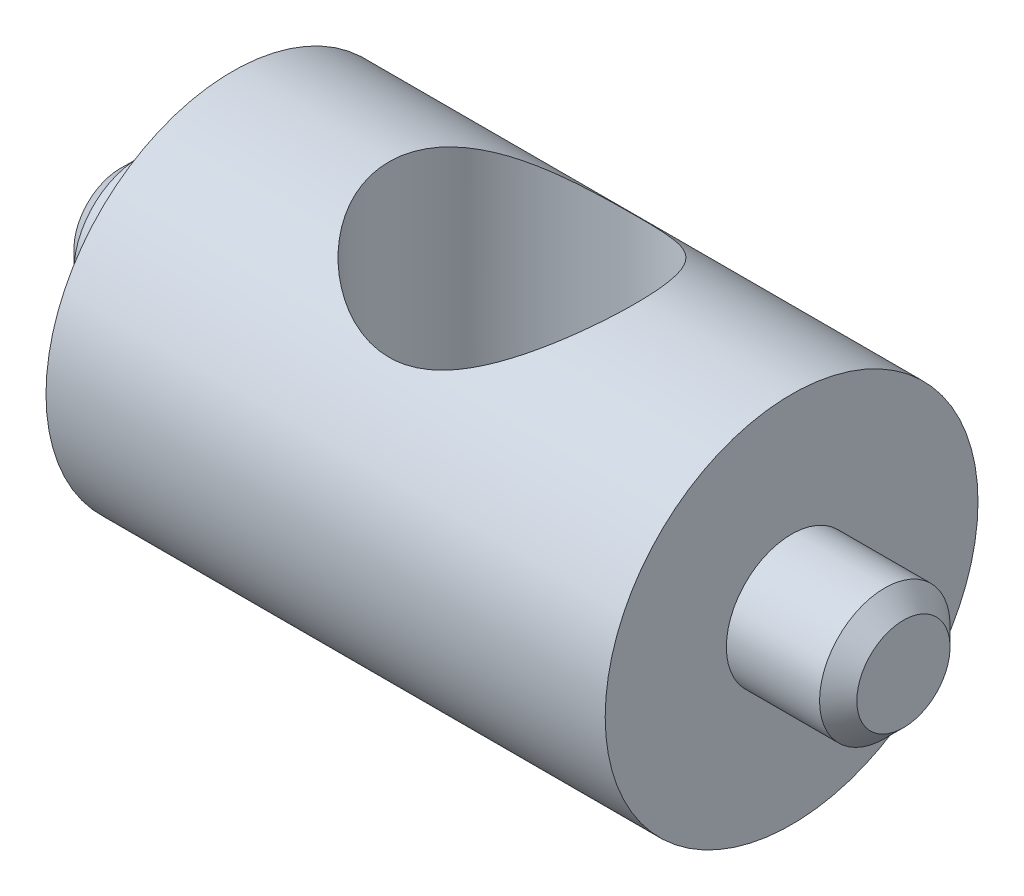
ISO-10303-21;
HEADER;
FILE_DESCRIPTION(('STEP AP214'),'2;1');
FILE_NAME('part.step','',(''),(''),'','','');
FILE_SCHEMA(('AUTOMOTIVE_DESIGN { 1 0 10303 214 1 1 1 1 }'));
ENDSEC;
DATA;
#1=APPLICATION_CONTEXT('core data for automotive mechanical design processes');
#2=APPLICATION_PROTOCOL_DEFINITION('international standard','automotive_design',2000,#1);
#3=PRODUCT_CONTEXT('',#1,'mechanical');
#4=PRODUCT('Part','Part','',(#3));
#5=PRODUCT_RELATED_PRODUCT_CATEGORY('part','',(#4));
#6=PRODUCT_DEFINITION_FORMATION('','',#4);
#7=PRODUCT_DEFINITION_CONTEXT('part definition',#1,'design');
#8=PRODUCT_DEFINITION('design','',#6,#7);
#9=PRODUCT_DEFINITION_SHAPE('','',#8);
#10=(LENGTH_UNIT() NAMED_UNIT(*) SI_UNIT(.MILLI.,.METRE.));
#11=(NAMED_UNIT(*) PLANE_ANGLE_UNIT() SI_UNIT($,.RADIAN.));
#12=(NAMED_UNIT(*) SI_UNIT($,.STERADIAN.) SOLID_ANGLE_UNIT());
#13=UNCERTAINTY_MEASURE_WITH_UNIT(LENGTH_MEASURE(1.E-05),#10,'distance_accuracy_value','');
#14=(GEOMETRIC_REPRESENTATION_CONTEXT(3) GLOBAL_UNCERTAINTY_ASSIGNED_CONTEXT((#13)) GLOBAL_UNIT_ASSIGNED_CONTEXT((#10,
#11,#12)) REPRESENTATION_CONTEXT('',''));
#15=CARTESIAN_POINT('',(0.,0.,0.));
#16=DIRECTION('',(0.,0.,1.));
#17=DIRECTION('',(1.,0.,0.));
#18=AXIS2_PLACEMENT_3D('',#15,#16,#17);
#19=CARTESIAN_POINT('',(-21.,0.,0.));
#20=DIRECTION('',(1.,0.,0.));
#21=DIRECTION('',(0.,0.,-1.));
#22=AXIS2_PLACEMENT_3D('',#19,#20,#21);
#23=PLANE('',#22);
#24=CARTESIAN_POINT('',(-21.,0.,0.));
#25=DIRECTION('',(1.,0.,0.));
#26=DIRECTION('',(0.,0.,-1.));
#27=AXIS2_PLACEMENT_3D('',#24,#25,#26);
#28=CIRCLE('',#27,1.25000000000001);
#29=CARTESIAN_POINT('',(-21.,0.,-1.25000000000001));
#30=VERTEX_POINT('',#29);
#31=EDGE_CURVE('E64',#30,#30,#28,.F.);
#32=ORIENTED_EDGE('',*,*,#31,.T.);
#33=EDGE_LOOP('',(#32));
#34=FACE_BOUND('',#33,.T.);
#35=ADVANCED_FACE('F40',(#34),#23,.F.);
#36=CARTESIAN_POINT('',(-35.932586733368,0.,0.));
#37=DIRECTION('',(-1.,0.,0.));
#38=DIRECTION('',(0.,0.,1.));
#39=AXIS2_PLACEMENT_3D('',#36,#37,#38);
#40=CYLINDRICAL_SURFACE('',#39,1.75);
#41=CARTESIAN_POINT('',(-20.5,0.,0.));
#42=DIRECTION('',(1.,0.,0.));
#43=DIRECTION('',(0.,0.,-1.));
#44=AXIS2_PLACEMENT_3D('',#41,#42,#43);
#45=CIRCLE('',#44,1.75);
#46=CARTESIAN_POINT('',(-20.5,0.,-1.75));
#47=VERTEX_POINT('',#46);
#48=EDGE_CURVE('E59',#47,#47,#45,.T.);
#49=ORIENTED_EDGE('',*,*,#48,.T.);
#50=EDGE_LOOP('',(#49));
#51=FACE_BOUND('',#50,.T.);
#52=CARTESIAN_POINT('',(-18.,0.,0.));
#53=DIRECTION('',(-1.,0.,0.));
#54=DIRECTION('',(0.,0.,1.));
#55=AXIS2_PLACEMENT_3D('',#52,#53,#54);
#56=CIRCLE('',#55,1.75);
#57=CARTESIAN_POINT('',(-18.,0.,1.75));
#58=VERTEX_POINT('',#57);
#59=EDGE_CURVE('E124',#58,#58,#56,.T.);
#60=ORIENTED_EDGE('',*,*,#59,.T.);
#61=EDGE_LOOP('',(#60));
#62=FACE_BOUND('',#61,.T.);
#63=ADVANCED_FACE('F98',(#51,#62),#40,.T.);
#64=CARTESIAN_POINT('',(-18.,1.75,0.));
#65=DIRECTION('',(1.,0.,0.));
#66=DIRECTION('',(0.,0.,-1.));
#67=AXIS2_PLACEMENT_3D('',#64,#65,#66);
#68=PLANE('',#67);
#69=ORIENTED_EDGE('',*,*,#59,.F.);
#70=EDGE_LOOP('',(#69));
#71=FACE_BOUND('',#70,.T.);
#72=CARTESIAN_POINT('',(-18.,0.,0.));
#73=DIRECTION('',(-1.,0.,0.));
#74=DIRECTION('',(0.,0.,1.));
#75=AXIS2_PLACEMENT_3D('',#72,#73,#74);
#76=CIRCLE('',#75,5.);
#77=CARTESIAN_POINT('',(-18.,0.,5.));
#78=VERTEX_POINT('',#77);
#79=EDGE_CURVE('E130',#78,#78,#76,.T.);
#80=ORIENTED_EDGE('',*,*,#79,.T.);
#81=EDGE_LOOP('',(#80));
#82=FACE_BOUND('',#81,.T.);
#83=ADVANCED_FACE('F94',(#71,#82),#68,.F.);
#84=CARTESIAN_POINT('',(-35.932586733368,0.,0.));
#85=DIRECTION('',(-1.,0.,0.));
#86=DIRECTION('',(0.,0.,1.));
#87=AXIS2_PLACEMENT_3D('',#84,#85,#86);
#88=CYLINDRICAL_SURFACE('',#87,5.);
#89=CARTESIAN_POINT('',(-13.8,-5.,0.));
#90=CARTESIAN_POINT('',(-13.7999943611885,-4.99999502028465,0.166108710098672));
#91=CARTESIAN_POINT('',(-13.7873858250924,-4.99164753654693,0.332252498914091));
#92=CARTESIAN_POINT('',(-13.7377125989929,-4.95907653058056,0.65925676172374));
#93=CARTESIAN_POINT('',(-13.7006328501233,-4.93484323274975,0.820113918452736));
#94=CARTESIAN_POINT('',(-13.6042743408841,-4.87290139155569,1.13133315611172));
#95=CARTESIAN_POINT('',(-13.5450998117015,-4.83525615606229,1.28174064243974));
#96=CARTESIAN_POINT('',(-13.4070539211593,-4.74953043835422,1.56990203300708));
#97=CARTESIAN_POINT('',(-13.3281799884932,-4.70144859398629,1.70765428218146));
#98=CARTESIAN_POINT('',(-13.145739026376,-4.59391320882249,1.97967369690098));
#99=CARTESIAN_POINT('',(-13.0406531316869,-4.5338433717197,2.11267338712332));
#100=CARTESIAN_POINT('',(-12.8123790467943,-4.40997691658213,2.3603657120324));
#101=CARTESIAN_POINT('',(-12.6891652417367,-4.34617510337841,2.47503195500737));
#102=CARTESIAN_POINT('',(-12.4060507859958,-4.21013569170478,2.70086298078244));
#103=CARTESIAN_POINT('',(-12.2434226613522,-4.13811352517936,2.80876420400794));
#104=CARTESIAN_POINT('',(-11.8982416669063,-4.004985037006,2.99553986488907));
#105=CARTESIAN_POINT('',(-11.7157239773053,-3.94385993007193,3.07446450871726));
#106=CARTESIAN_POINT('',(-11.3882712104839,-3.85768009853687,3.18144981131808));
#107=CARTESIAN_POINT('',(-11.2473879383095,-3.82731140798266,3.21759047163841));
#108=CARTESIAN_POINT('',(-10.9598037022303,-3.78171686850453,3.27106798534483));
#109=CARTESIAN_POINT('',(-10.8131128910142,-3.76646570994091,3.28843627169807));
#110=CARTESIAN_POINT('',(-10.5173533483337,-3.75345502550718,3.30328522471618));
#111=CARTESIAN_POINT('',(-10.3682776930258,-3.75576227122264,3.30068997308214));
#112=CARTESIAN_POINT('',(-10.0730470765962,-3.77763788475175,3.2756222186249));
#113=CARTESIAN_POINT('',(-9.92689468913715,-3.79722083238981,3.25313292618685));
#114=CARTESIAN_POINT('',(-9.64726482245536,-3.8495429246868,3.19101249701415));
#115=CARTESIAN_POINT('',(-9.51351391935375,-3.88172023925271,3.15210848368895));
#116=CARTESIAN_POINT('',(-9.25430091748071,-3.95554016109238,3.05895820499945));
#117=CARTESIAN_POINT('',(-9.12884155630582,-3.99718587457051,3.00470690337154));
#118=CARTESIAN_POINT('',(-8.86290181356779,-4.09534689411061,2.86991118840526));
#119=CARTESIAN_POINT('',(-8.72447542024702,-4.15316821979757,2.78627309404565));
#120=CARTESIAN_POINT('',(-8.46201613583647,-4.2719636274419,2.6004841327672));
#121=CARTESIAN_POINT('',(-8.33800118650155,-4.33294150559811,2.49831058648533));
#122=CARTESIAN_POINT('',(-8.08159163521438,-4.4659051432063,2.25363350243056));
#123=CARTESIAN_POINT('',(-7.95277126312606,-4.53755838228618,2.10715945828944));
#124=CARTESIAN_POINT('',(-7.7213875182802,-4.67138209023644,1.79097028772677));
#125=CARTESIAN_POINT('',(-7.6187985376901,-4.73356178329532,1.62127807796112));
#126=CARTESIAN_POINT('',(-7.46153874028141,-4.83107163272198,1.29747885255322));
#127=CARTESIAN_POINT('',(-7.40140859238575,-4.86927827550549,1.14689281517846));
#128=CARTESIAN_POINT('',(-7.30348806291977,-4.9321668292038,0.835952102745351));
#129=CARTESIAN_POINT('',(-7.26567898723602,-4.95686005646507,0.675605726589939));
#130=CARTESIAN_POINT('',(-7.21429574910262,-4.99053806559512,0.348733519143495));
#131=CARTESIAN_POINT('',(-7.20082007734955,-4.99945900529635,0.182185347019977));
#132=CARTESIAN_POINT('',(-7.19925317006995,-5.0004926515669,-0.151090954294901));
#133=CARTESIAN_POINT('',(-7.21116109529651,-4.99260591384121,-0.317819077354457));
#134=CARTESIAN_POINT('',(-7.25799645951894,-4.96188552601813,-0.635181990133433));
#135=CARTESIAN_POINT('',(-7.29135750362683,-4.94006962951612,-0.786153811834619));
#136=CARTESIAN_POINT('',(-7.37793028689531,-4.884283635727,-1.07988019820454));
#137=CARTESIAN_POINT('',(-7.43114521435539,-4.85031158634097,-1.22263343881362));
#138=CARTESIAN_POINT('',(-7.55936397391898,-4.7701857792491,-1.50612380113317));
#139=CARTESIAN_POINT('',(-7.63554961985883,-4.72338877459165,-1.64613997808855));
#140=CARTESIAN_POINT('',(-7.80565784463877,-4.6222077528961,-1.91192488806832));
#141=CARTESIAN_POINT('',(-7.89959212595509,-4.56781873631822,-2.03768413282188));
#142=CARTESIAN_POINT('',(-8.1192216083794,-4.44617198705788,-2.29225677449161));
#143=CARTESIAN_POINT('',(-8.24758833834775,-4.37823534715727,-2.41844252214993));
#144=CARTESIAN_POINT('',(-8.52333114446552,-4.24296654132022,-2.64859586348366));
#145=CARTESIAN_POINT('',(-8.6707181645745,-4.1756347474461,-2.75255057357021));
#146=CARTESIAN_POINT('',(-8.96740679863461,-4.05491811042689,-2.92707280109245));
#147=CARTESIAN_POINT('',(-9.11505909545937,-4.0008121534813,-2.99993302294647));
#148=CARTESIAN_POINT('',(-9.42299263819253,-3.90495718130228,-3.12369425956629));
#149=CARTESIAN_POINT('',(-9.58325045328032,-3.86318589532471,-3.17463492797536));
#150=CARTESIAN_POINT('',(-9.8855971225215,-3.80386546293905,-3.24536399087742));
#151=CARTESIAN_POINT('',(-10.0262166605061,-3.78342635400983,-3.26894766111121));
#152=CARTESIAN_POINT('',(-10.3106776631035,-3.75843740759422,-3.29765655618299));
#153=CARTESIAN_POINT('',(-10.4545159048156,-3.75387233408162,-3.3027994807441));
#154=CARTESIAN_POINT('',(-10.7411822510331,-3.76133210537923,-3.29429853523358));
#155=CARTESIAN_POINT('',(-10.8840103202048,-3.77335752763225,-3.28065401125281));
#156=CARTESIAN_POINT('',(-11.1648049297324,-3.81215585003775,-3.23547879226547));
#157=CARTESIAN_POINT('',(-11.3027647982596,-3.83894821205136,-3.20392449170545));
#158=CARTESIAN_POINT('',(-11.6083413057152,-3.91289022491186,-3.11344763662037));
#159=CARTESIAN_POINT('',(-11.7735435063226,-3.96362822464801,-3.04935599134409));
#160=CARTESIAN_POINT('',(-12.0887896412793,-4.07583386672655,-2.89766420424647));
#161=CARTESIAN_POINT('',(-12.2388121136513,-4.13731637459582,-2.81003140070026));
#162=CARTESIAN_POINT('',(-12.5246840794622,-4.26529629098292,-2.61178611200579));
#163=CARTESIAN_POINT('',(-12.6602457103062,-4.331861722496,-2.50080460661305));
#164=CARTESIAN_POINT('',(-12.9127245619386,-4.46314010332462,-2.2581808806654));
#165=CARTESIAN_POINT('',(-13.0296364198491,-4.52785251541748,-2.1265327387837));
#166=CARTESIAN_POINT('',(-13.1958321809237,-4.62332464314167,-1.90588764586633));
#167=CARTESIAN_POINT('',(-13.2523684227856,-4.65658028787928,-1.82333941616893));
#168=CARTESIAN_POINT('',(-13.3581645487176,-4.71988387666673,-1.65256618994112));
#169=CARTESIAN_POINT('',(-13.4074279100888,-4.7499333517286,-1.5643439354252));
#170=CARTESIAN_POINT('',(-13.4980230915444,-4.80592095491253,-1.38279849314792));
#171=CARTESIAN_POINT('',(-13.5393643237897,-4.83186395541528,-1.28948152992106));
#172=CARTESIAN_POINT('',(-13.6135270500507,-4.8788554955818,-1.09838943293768));
#173=CARTESIAN_POINT('',(-13.6463520121404,-4.89990602723681,-1.00061613306229));
#174=CARTESIAN_POINT('',(-13.7157236375915,-4.94468119082629,-0.756133259341444));
#175=CARTESIAN_POINT('',(-13.7472005075712,-4.96528498623918,-0.607349631931563));
#176=CARTESIAN_POINT('',(-13.7893356928824,-4.99294304369993,-0.305719088871816));
#177=CARTESIAN_POINT('',(-13.8000051895529,-5.00000458296857,-0.152874400317295));
#178=CARTESIAN_POINT('',(-13.8,-5.,0.));
#179=B_SPLINE_CURVE_WITH_KNOTS('',3,(#89,#90,#91,#92,#93,#94,#95,#96,#97,#98,#99,#100,#101,#102,
#103,#104,#105,#106,#107,#108,#109,#110,#111,#112,#113,#114,#115,#116,#117,#118,#119,#120,#121,
#122,#123,#124,#125,#126,#127,#128,#129,#130,#131,#132,#133,#134,#135,#136,#137,#138,#139,#140,
#141,#142,#143,#144,#145,#146,#147,#148,#149,#150,#151,#152,#153,#154,#155,#156,#157,#158,#159,
#160,#161,#162,#163,#164,#165,#166,#167,#168,#169,#170,#171,#172,#173,#174,#175,#176,#177,#178),
.UNSPECIFIED.,.T.,.F.,(4,2,2,2,2,2,2,2,2,2,2,2,2,2,2,2,2,2,2,2,2,2,2,2,2,2,2,2,2,2,2,2,2,2,2,2,
2,2,2,2,2,2,2,2,4),(0.,0.497726346438328,0.995759265011475,1.49147182327557,1.98724911932336,
2.52472285398069,3.06296346909751,3.68416119442296,4.30427746662549,4.74824206332347,
5.19146211660388,5.63636849926013,6.0816507201402,6.50899317832885,6.93647603335879,
7.44993759598858,7.96403170330016,8.58448225944135,9.20432478137938,9.70198972827775,
10.1992372825104,10.6984929984065,11.1977322078819,11.6641183533543,12.1305794272009,
12.627059041866,13.1238671575372,13.6987737764681,14.2740126744385,14.7920218070748,
15.3090898529516,15.7393109775655,16.1691190583515,16.5989420992603,17.0293329781066,
17.5793444324805,18.130122966495,18.6903664780719,19.2507708024659,19.5666924494275,
19.8824625556849,20.1978551421486,20.5131190892222,20.9714366484685,21.4295078518911),.UNSPECIFIED.);
#180=CARTESIAN_POINT('',(-13.8,-5.,0.));
#181=VERTEX_POINT('',#180);
#182=EDGE_CURVE('E10',#181,#181,#179,.T.);
#183=ORIENTED_EDGE('',*,*,#182,.T.);
#184=EDGE_LOOP('',(#183));
#185=FACE_BOUND('',#184,.T.);
#186=CARTESIAN_POINT('',(-10.5,3.75632799419859,3.3));
#187=CARTESIAN_POINT('',(-10.5808328035541,3.75632034068253,3.30000469991596));
#188=CARTESIAN_POINT('',(-10.6616331441055,3.75894514819494,3.2970270028327));
#189=CARTESIAN_POINT('',(-10.8224991006649,3.76929395841671,3.28519268099924));
#190=CARTESIAN_POINT('',(-10.9025645671875,3.77701897626405,3.27633488588152));
#191=CARTESIAN_POINT('',(-11.0613388907219,3.79722090967184,3.25289861749666));
#192=CARTESIAN_POINT('',(-11.1400459117131,3.80970379908599,3.23831295177074));
#193=CARTESIAN_POINT('',(-11.2954699141301,3.83887160299462,3.20368164011157));
#194=CARTESIAN_POINT('',(-11.3721858638929,3.85555864972917,3.1836332231901));
#195=CARTESIAN_POINT('',(-11.5971624593058,3.9106000137406,3.11617633548866));
#196=CARTESIAN_POINT('',(-11.7419438565215,3.95417390734364,3.06119665841899));
#197=CARTESIAN_POINT('',(-12.0199195076028,4.05006804336513,2.93314323737888));
#198=CARTESIAN_POINT('',(-12.1531112170257,4.10239019908004,2.86006553357735));
#199=CARTESIAN_POINT('',(-12.4264211232277,4.21943336138612,2.68497487992134));
#200=CARTESIAN_POINT('',(-12.5645144768536,4.28483009958964,2.58025207827139));
#201=CARTESIAN_POINT('',(-12.8229743883406,4.41517326533073,2.35025919723939));
#202=CARTESIAN_POINT('',(-12.9433239849493,4.48011920617503,2.22496969679138));
#203=CARTESIAN_POINT('',(-13.1165812283686,4.57753337479149,2.01330163660346));
#204=CARTESIAN_POINT('',(-13.1762694313582,4.61198002131685,1.93329401134096));
#205=CARTESIAN_POINT('',(-13.288601649869,4.67805851138964,1.76740647266276));
#206=CARTESIAN_POINT('',(-13.341248884277,4.70969163894955,1.68152926993491));
#207=CARTESIAN_POINT('',(-13.4388963971442,4.76923654241945,1.50436472285813));
#208=CARTESIAN_POINT('',(-13.4839007660791,4.79715030720502,1.41308030797008));
#209=CARTESIAN_POINT('',(-13.565649261652,4.84842150261802,1.22565887290276));
#210=CARTESIAN_POINT('',(-13.6023951124925,4.87177988417736,1.12952287077345));
#211=CARTESIAN_POINT('',(-13.6634234716522,4.91088206157612,0.944036218297515));
#212=CARTESIAN_POINT('',(-13.6886339565399,4.92718174864422,0.855107813942848));
#213=CARTESIAN_POINT('',(-13.7316082007735,4.95510084996898,0.674758403177167));
#214=CARTESIAN_POINT('',(-13.7493733809472,4.96672115720055,0.583337875901359));
#215=CARTESIAN_POINT('',(-13.7771259423381,4.98492159339129,0.398907822203913));
#216=CARTESIAN_POINT('',(-13.7871207565257,4.99150653897338,0.305899901522933));
#217=CARTESIAN_POINT('',(-13.7991759406972,4.99945458509008,0.119183398594345));
#218=CARTESIAN_POINT('',(-13.801237394461,5.00081839888562,0.0254749138036905));
#219=CARTESIAN_POINT('',(-13.7959962832785,4.99735470156518,-0.227310173080534));
#220=CARTESIAN_POINT('',(-13.7811330465739,4.98752780710882,-0.38625014627874));
#221=CARTESIAN_POINT('',(-13.7290794671699,4.95344130946267,-0.698707472956844));
#222=CARTESIAN_POINT('',(-13.691887480834,4.92918064379297,-0.852224426363109));
#223=CARTESIAN_POINT('',(-13.5971690686483,4.8683819237218,-1.14971660266121));
#224=CARTESIAN_POINT('',(-13.5397000509535,4.83187854506441,-1.29371741494539));
#225=CARTESIAN_POINT('',(-13.406636195436,4.74929647463493,-1.57003628564077));
#226=CARTESIAN_POINT('',(-13.3310379355112,4.70321597529091,-1.70235213192125));
#227=CARTESIAN_POINT('',(-13.1528962540669,4.5980447774444,-1.97009329194165));
#228=CARTESIAN_POINT('',(-13.0481245679526,4.53804109537535,-2.10367372412714));
#229=CARTESIAN_POINT('',(-12.8203804903757,4.4141844114235,-2.35251956536639));
#230=CARTESIAN_POINT('',(-12.697380144608,4.35032558829371,-2.46775627052381));
#231=CARTESIAN_POINT('',(-12.4150137937046,4.21422095539497,-2.69449862293978));
#232=CARTESIAN_POINT('',(-12.2529613921193,4.14216856539377,-2.80279991205088));
#233=CARTESIAN_POINT('',(-11.908940448696,4.00875915605853,-2.99050460310514));
#234=CARTESIAN_POINT('',(-11.7270068429694,3.9473838513265,-3.06995766894008));
#235=CARTESIAN_POINT('',(-11.4000980231064,3.8604241242264,-3.17813219498004));
#236=CARTESIAN_POINT('',(-11.2591661237478,3.82962752773358,-3.21484131617385));
#237=CARTESIAN_POINT('',(-10.9713696766155,3.7831392498888,-3.26943056839627));
#238=CARTESIAN_POINT('',(-10.8245154921042,3.76742228236837,-3.28734222456948));
#239=CARTESIAN_POINT('',(-10.5282779620281,3.75351270993072,-3.30322201627699));
#240=CARTESIAN_POINT('',(-10.378886911605,3.75538964839794,-3.30111100788955));
#241=CARTESIAN_POINT('',(-10.0829334157415,3.77651829460744,-3.27691017579369));
#242=CARTESIAN_POINT('',(-9.93637340174476,3.79578431359181,-3.25480389591166));
#243=CARTESIAN_POINT('',(-9.65631213978163,3.84754641529864,-3.19341308351927));
#244=CARTESIAN_POINT('',(-9.52252031301888,3.87943658687403,-3.15490987890829));
#245=CARTESIAN_POINT('',(-9.26317642029136,3.95274950238599,-3.06255431939491));
#246=CARTESIAN_POINT('',(-9.137627103684,3.99417540649065,-3.00869687464051));
#247=CARTESIAN_POINT('',(-8.87169306743346,4.09184048090701,-2.8748874359208));
#248=CARTESIAN_POINT('',(-8.73333255480008,4.14938676540834,-2.79187482996907));
#249=CARTESIAN_POINT('',(-8.47090800665095,4.26772614257934,-2.60740385857645));
#250=CARTESIAN_POINT('',(-8.34686166838993,4.32852312123433,-2.50592305101424));
#251=CARTESIAN_POINT('',(-8.09004558637145,4.46132208666665,-2.26265118716519));
#252=CARTESIAN_POINT('',(-7.96085651143773,4.53301505734816,-2.11686736878664));
#253=CARTESIAN_POINT('',(-7.72858588963537,4.66709483079829,-1.80205827224493));
#254=CARTESIAN_POINT('',(-7.62547967569073,4.72949040317013,-1.63305518823095));
#255=CARTESIAN_POINT('',(-7.4669259239447,4.82767856958792,-1.31004487389785));
#256=CARTESIAN_POINT('',(-7.40610641232805,4.86628589212662,-1.15953396552451));
#257=CARTESIAN_POINT('',(-7.30681540008732,4.93000688406096,-0.848611435594714));
#258=CARTESIAN_POINT('',(-7.26832518634858,4.95513185104415,-0.688208229398042));
#259=CARTESIAN_POINT('',(-7.21561558374301,4.98966718389319,-0.361064115000356));
#260=CARTESIAN_POINT('',(-7.20149673391073,4.99901245042292,-0.19429984068167));
#261=CARTESIAN_POINT('',(-7.19873043457225,5.0008376198483,0.13954060936531));
#262=CARTESIAN_POINT('',(-7.21008182590642,4.99331829025766,0.306616770553763));
#263=CARTESIAN_POINT('',(-7.25591896331189,4.96324448975663,0.624497684179487));
#264=CARTESIAN_POINT('',(-7.28879653524275,4.94173582286798,0.775640811829075));
#265=CARTESIAN_POINT('',(-7.37445232775415,4.88650995006837,1.06978191300973));
#266=CARTESIAN_POINT('',(-7.42723367574502,4.85279082560424,1.21277860245311));
#267=CARTESIAN_POINT('',(-7.5545139315903,4.77318196944304,1.49659946274411));
#268=CARTESIAN_POINT('',(-7.63016789565923,4.72666124587104,1.63672410409441));
#269=CARTESIAN_POINT('',(-7.7992151789931,4.62597329910768,1.90279946751913));
#270=CARTESIAN_POINT('',(-7.89261996133958,4.5718011406277,2.02874094626101));
#271=CARTESIAN_POINT('',(-8.11105810396569,4.45056263813156,2.28372554674123));
#272=CARTESIAN_POINT('',(-8.23875421793992,4.38280613983599,2.41016067480579));
#273=CARTESIAN_POINT('',(-8.51313686655812,4.24774594796383,2.64093531178594));
#274=CARTESIAN_POINT('',(-8.65983564054414,4.18044257588748,2.74526046482088));
#275=CARTESIAN_POINT('',(-8.95594577331737,4.05926347444089,2.92107485155351));
#276=CARTESIAN_POINT('',(-9.10378766446403,4.00471979811661,2.99473675204751));
#277=CARTESIAN_POINT('',(-9.41222051199397,3.90794187024756,3.11998197813732));
#278=CARTESIAN_POINT('',(-9.57278338710108,3.86568141694667,3.17161241165936));
#279=CARTESIAN_POINT('',(-9.86137657297142,3.80831125262273,3.24009605137427));
#280=CARTESIAN_POINT('',(-9.98727334976011,3.78902736893447,3.2624582500962));
#281=CARTESIAN_POINT('',(-10.2421420580733,3.76304522883302,3.2924024993676));
#282=CARTESIAN_POINT('',(-10.3711122963676,3.75634019771086,3.29999250599572));
#283=CARTESIAN_POINT('',(-10.5,3.75632799419859,3.3));
#284=B_SPLINE_CURVE_WITH_KNOTS('',3,(#186,#187,#188,#189,#190,#191,#192,#193,#194,#195,#196,
#197,#198,#199,#200,#201,#202,#203,#204,#205,#206,#207,#208,#209,#210,#211,#212,#213,#214,#215,
#216,#217,#218,#219,#220,#221,#222,#223,#224,#225,#226,#227,#228,#229,#230,#231,#232,#233,#234,
#235,#236,#237,#238,#239,#240,#241,#242,#243,#244,#245,#246,#247,#248,#249,#250,#251,#252,#253,
#254,#255,#256,#257,#258,#259,#260,#261,#262,#263,#264,#265,#266,#267,#268,#269,#270,#271,#272,
#273,#274,#275,#276,#277,#278,#279,#280,#281,#282,#283),.UNSPECIFIED.,.T.,.F.,(4,2,2,2,2,2,2,2,
2,2,2,2,2,2,2,2,2,2,2,2,2,2,2,2,2,2,2,2,2,2,2,2,2,2,2,2,2,2,2,2,2,2,2,2,2,2,2,2,4),(0.,
0.242346562582374,0.484741375997029,0.727441541664081,0.97026504725607,1.45079360698386,
1.93142739893815,2.4851233692169,3.03934523269319,3.35576290953679,3.67203543307438,
3.98813814985147,4.30417480968889,4.58532916772532,4.86642984708851,5.14726129940125,
5.42805438584568,5.90530512510263,6.38259099946519,6.85853628812263,7.33457148771491,
7.87268829158052,8.41163902374084,9.03215933205793,9.65160625593664,10.096392802684,
10.5404322019819,10.9862274924227,11.4323900080049,11.8593257161564,12.2864031162016,
12.7985244909691,13.3112723901066,13.9310107618911,14.5501608251217,15.0486475340571,
15.5467158794154,16.0468340358446,16.5469294321824,17.0133720923553,17.4798880735816,
17.9756813075918,18.4717958085011,19.0456724832362,19.6199206389234,20.139844423051,
20.658650861001,21.0452801408669,21.4317011303791),.UNSPECIFIED.);
#285=CARTESIAN_POINT('',(-10.5,3.75632799419859,3.3));
#286=VERTEX_POINT('',#285);
#287=EDGE_CURVE('E54',#286,#286,#284,.T.);
#288=ORIENTED_EDGE('',*,*,#287,.T.);
#289=EDGE_LOOP('',(#288));
#290=FACE_BOUND('',#289,.T.);
#291=ORIENTED_EDGE('',*,*,#79,.F.);
#292=EDGE_LOOP('',(#291));
#293=FACE_BOUND('',#292,.T.);
#294=CARTESIAN_POINT('',(-3.,0.,0.));
#295=DIRECTION('',(-1.,0.,0.));
#296=DIRECTION('',(0.,0.,1.));
#297=AXIS2_PLACEMENT_3D('',#294,#295,#296);
#298=CIRCLE('',#297,5.);
#299=CARTESIAN_POINT('',(-3.,0.,5.));
#300=VERTEX_POINT('',#299);
#301=EDGE_CURVE('E139',#300,#300,#298,.T.);
#302=ORIENTED_EDGE('',*,*,#301,.T.);
#303=EDGE_LOOP('',(#302));
#304=FACE_BOUND('',#303,.T.);
#305=ADVANCED_FACE('F70',(#185,#290,#293,#304),#88,.T.);
#306=CARTESIAN_POINT('',(-3.,5.,0.));
#307=DIRECTION('',(-1.,0.,0.));
#308=DIRECTION('',(0.,0.,1.));
#309=AXIS2_PLACEMENT_3D('',#306,#307,#308);
#310=PLANE('',#309);
#311=ORIENTED_EDGE('',*,*,#301,.F.);
#312=EDGE_LOOP('',(#311));
#313=FACE_BOUND('',#312,.T.);
#314=CARTESIAN_POINT('',(-3.,0.,0.));
#315=DIRECTION('',(-1.,0.,0.));
#316=DIRECTION('',(0.,0.,1.));
#317=AXIS2_PLACEMENT_3D('',#314,#315,#316);
#318=CIRCLE('',#317,1.75);
#319=CARTESIAN_POINT('',(-3.,0.,1.75));
#320=VERTEX_POINT('',#319);
#321=EDGE_CURVE('E143',#320,#320,#318,.T.);
#322=ORIENTED_EDGE('',*,*,#321,.T.);
#323=EDGE_LOOP('',(#322));
#324=FACE_BOUND('',#323,.T.);
#325=ADVANCED_FACE('F87',(#313,#324),#310,.F.);
#326=CARTESIAN_POINT('',(-35.932586733368,0.,0.));
#327=DIRECTION('',(-1.,0.,0.));
#328=DIRECTION('',(0.,0.,1.));
#329=AXIS2_PLACEMENT_3D('',#326,#327,#328);
#330=CYLINDRICAL_SURFACE('',#329,1.75);
#331=CARTESIAN_POINT('',(-0.5,0.,0.));
#332=DIRECTION('',(-1.,0.,0.));
#333=DIRECTION('',(0.,0.,1.));
#334=AXIS2_PLACEMENT_3D('',#331,#332,#333);
#335=CIRCLE('',#334,1.75);
#336=CARTESIAN_POINT('',(-0.5,0.,1.75));
#337=VERTEX_POINT('',#336);
#338=EDGE_CURVE('E122',#337,#337,#335,.T.);
#339=ORIENTED_EDGE('',*,*,#338,.T.);
#340=EDGE_LOOP('',(#339));
#341=FACE_BOUND('',#340,.T.);
#342=ORIENTED_EDGE('',*,*,#321,.F.);
#343=EDGE_LOOP('',(#342));
#344=FACE_BOUND('',#343,.T.);
#345=ADVANCED_FACE('F84',(#341,#344),#330,.T.);
#346=CARTESIAN_POINT('',(0.,1.75,0.));
#347=DIRECTION('',(-1.,0.,0.));
#348=DIRECTION('',(0.,0.,1.));
#349=AXIS2_PLACEMENT_3D('',#346,#347,#348);
#350=PLANE('',#349);
#351=CARTESIAN_POINT('',(0.,0.,0.));
#352=DIRECTION('',(-1.,0.,0.));
#353=DIRECTION('',(0.,0.,1.));
#354=AXIS2_PLACEMENT_3D('',#351,#352,#353);
#355=CIRCLE('',#354,1.25);
#356=CARTESIAN_POINT('',(0.,0.,1.25));
#357=VERTEX_POINT('',#356);
#358=EDGE_CURVE('E119',#357,#357,#355,.F.);
#359=ORIENTED_EDGE('',*,*,#358,.T.);
#360=EDGE_LOOP('',(#359));
#361=FACE_BOUND('',#360,.T.);
#362=ADVANCED_FACE('F79',(#361),#350,.F.);
#363=CARTESIAN_POINT('',(-0.5,0.,0.));
#364=DIRECTION('',(-1.,0.,0.));
#365=DIRECTION('',(0.,0.,1.));
#366=AXIS2_PLACEMENT_3D('',#363,#364,#365);
#367=CONICAL_SURFACE('',#366,1.75,0.78539816339745);
#368=ORIENTED_EDGE('',*,*,#358,.F.);
#369=EDGE_LOOP('',(#368));
#370=FACE_BOUND('',#369,.T.);
#371=ORIENTED_EDGE('',*,*,#338,.F.);
#372=EDGE_LOOP('',(#371));
#373=FACE_BOUND('',#372,.T.);
#374=ADVANCED_FACE('F83',(#370,#373),#367,.T.);
#375=CARTESIAN_POINT('',(-21.,0.,0.));
#376=DIRECTION('',(1.,0.,0.));
#377=DIRECTION('',(0.,0.,-1.));
#378=AXIS2_PLACEMENT_3D('',#375,#376,#377);
#379=CONICAL_SURFACE('',#378,1.25000000000001,0.785398163397443);
#380=ORIENTED_EDGE('',*,*,#48,.F.);
#381=EDGE_LOOP('',(#380));
#382=FACE_BOUND('',#381,.T.);
#383=ORIENTED_EDGE('',*,*,#31,.F.);
#384=EDGE_LOOP('',(#383));
#385=FACE_BOUND('',#384,.T.);
#386=ADVANCED_FACE('F43',(#382,#385),#379,.T.);
#387=CARTESIAN_POINT('',(-10.5,5.,0.));
#388=DIRECTION('',(0.,1.,0.));
#389=DIRECTION('',(0.,0.,1.));
#390=AXIS2_PLACEMENT_3D('',#387,#388,#389);
#391=CYLINDRICAL_SURFACE('',#390,3.3);
#392=ORIENTED_EDGE('',*,*,#287,.F.);
#393=EDGE_LOOP('',(#392));
#394=FACE_BOUND('',#393,.T.);
#395=ORIENTED_EDGE('',*,*,#182,.F.);
#396=EDGE_LOOP('',(#395));
#397=FACE_BOUND('',#396,.T.);
#398=ADVANCED_FACE('F74',(#394,#397),#391,.F.);
#399=CLOSED_SHELL('',(#35,#63,#83,#305,#325,#345,#362,#374,#386,#398));
#400=MANIFOLD_SOLID_BREP('B2',#399);
#401=ADVANCED_BREP_SHAPE_REPRESENTATION('',(#18,#400),#14);
#402=SHAPE_DEFINITION_REPRESENTATION(#9,#401);
ENDSEC;
END-ISO-10303-21;
